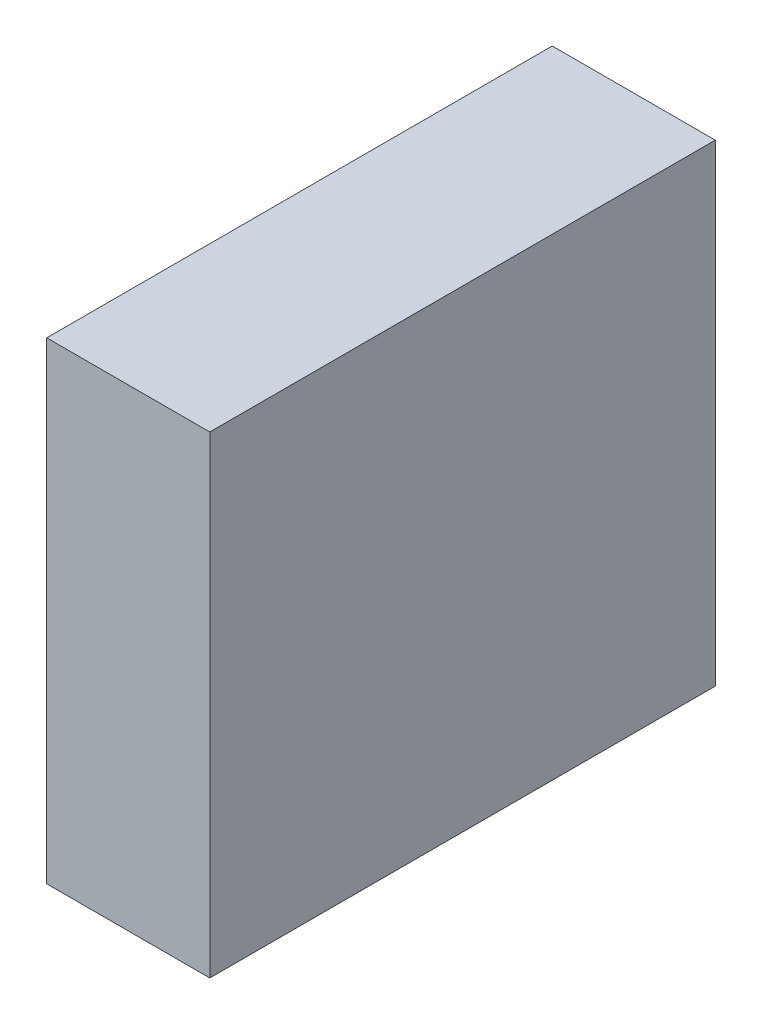
ISO-10303-21;
HEADER;
FILE_DESCRIPTION(('STEP AP214'),'2;1');
FILE_NAME('part.step','',(''),(''),'','','');
FILE_SCHEMA(('AUTOMOTIVE_DESIGN { 1 0 10303 214 1 1 1 1 }'));
ENDSEC;
DATA;
#1=APPLICATION_CONTEXT('core data for automotive mechanical design processes');
#2=APPLICATION_PROTOCOL_DEFINITION('international standard','automotive_design',2000,#1);
#3=PRODUCT_CONTEXT('',#1,'mechanical');
#4=PRODUCT('Part','Part','',(#3));
#5=PRODUCT_RELATED_PRODUCT_CATEGORY('part','',(#4));
#6=PRODUCT_DEFINITION_FORMATION('','',#4);
#7=PRODUCT_DEFINITION_CONTEXT('part definition',#1,'design');
#8=PRODUCT_DEFINITION('design','',#6,#7);
#9=PRODUCT_DEFINITION_SHAPE('','',#8);
#10=(LENGTH_UNIT() NAMED_UNIT(*) SI_UNIT(.MILLI.,.METRE.));
#11=(NAMED_UNIT(*) PLANE_ANGLE_UNIT() SI_UNIT($,.RADIAN.));
#12=(NAMED_UNIT(*) SI_UNIT($,.STERADIAN.) SOLID_ANGLE_UNIT());
#13=UNCERTAINTY_MEASURE_WITH_UNIT(LENGTH_MEASURE(1.E-05),#10,'distance_accuracy_value','');
#14=(GEOMETRIC_REPRESENTATION_CONTEXT(3) GLOBAL_UNCERTAINTY_ASSIGNED_CONTEXT((#13)) GLOBAL_UNIT_ASSIGNED_CONTEXT((#10,
#11,#12)) REPRESENTATION_CONTEXT('',''));
#15=CARTESIAN_POINT('',(0.,0.,0.));
#16=DIRECTION('',(0.,0.,1.));
#17=DIRECTION('',(1.,0.,0.));
#18=AXIS2_PLACEMENT_3D('',#15,#16,#17);
#19=CARTESIAN_POINT('',(-0.2499995,0.72499982,0.));
#20=DIRECTION('',(1.,0.,0.));
#21=DIRECTION('',(0.,-1.,0.));
#22=AXIS2_PLACEMENT_3D('',#19,#20,#21);
#23=PLANE('',#22);
#24=DIRECTION('',(0.,-1.,0.));
#25=VECTOR('',#24,1.);
#26=CARTESIAN_POINT('',(-0.2499995,0.72499982,0.));
#27=LINE('',#26,#25);
#28=CARTESIAN_POINT('',(-0.2499995,0.72499982,0.));
#29=VERTEX_POINT('',#28);
#30=CARTESIAN_POINT('',(-0.2499995,-0.72499982,0.));
#31=VERTEX_POINT('',#30);
#32=EDGE_CURVE('E11',#29,#31,#27,.T.);
#33=ORIENTED_EDGE('',*,*,#32,.T.);
#34=DIRECTION('',(0.,0.,1.));
#35=VECTOR('',#34,1.);
#36=CARTESIAN_POINT('',(-0.2499995,-0.72499982,0.));
#37=LINE('',#36,#35);
#38=CARTESIAN_POINT('',(-0.2499995,-0.72499982,1.54999944));
#39=VERTEX_POINT('',#38);
#40=EDGE_CURVE('E23',#31,#39,#37,.T.);
#41=ORIENTED_EDGE('',*,*,#40,.T.);
#42=DIRECTION('',(0.,-1.,0.));
#43=VECTOR('',#42,1.);
#44=CARTESIAN_POINT('',(-0.2499995,0.72499982,1.54999944));
#45=LINE('',#44,#43);
#46=CARTESIAN_POINT('',(-0.2499995,0.72499982,1.54999944));
#47=VERTEX_POINT('',#46);
#48=EDGE_CURVE('E86',#47,#39,#45,.T.);
#49=ORIENTED_EDGE('',*,*,#48,.F.);
#50=DIRECTION('',(0.,0.,1.));
#51=VECTOR('',#50,1.);
#52=CARTESIAN_POINT('',(-0.2499995,0.72499982,0.));
#53=LINE('',#52,#51);
#54=EDGE_CURVE('E35',#29,#47,#53,.T.);
#55=ORIENTED_EDGE('',*,*,#54,.F.);
#56=EDGE_LOOP('',(#33,#41,#49,#55));
#57=FACE_BOUND('',#56,.T.);
#58=ADVANCED_FACE('F16',(#57),#23,.F.);
#59=CARTESIAN_POINT('',(-0.2499995,-0.72499982,0.));
#60=DIRECTION('',(0.,1.,0.));
#61=DIRECTION('',(1.,0.,0.));
#62=AXIS2_PLACEMENT_3D('',#59,#60,#61);
#63=PLANE('',#62);
#64=DIRECTION('',(1.,0.,0.));
#65=VECTOR('',#64,1.);
#66=CARTESIAN_POINT('',(-0.2499995,-0.72499982,0.));
#67=LINE('',#66,#65);
#68=CARTESIAN_POINT('',(0.2499995,-0.72499982,0.));
#69=VERTEX_POINT('',#68);
#70=EDGE_CURVE('E83',#31,#69,#67,.T.);
#71=ORIENTED_EDGE('',*,*,#70,.T.);
#72=DIRECTION('',(0.,0.,1.));
#73=VECTOR('',#72,1.);
#74=CARTESIAN_POINT('',(0.2499995,-0.72499982,0.));
#75=LINE('',#74,#73);
#76=CARTESIAN_POINT('',(0.2499995,-0.72499982,1.54999944));
#77=VERTEX_POINT('',#76);
#78=EDGE_CURVE('E81',#69,#77,#75,.T.);
#79=ORIENTED_EDGE('',*,*,#78,.T.);
#80=DIRECTION('',(1.,0.,0.));
#81=VECTOR('',#80,1.);
#82=CARTESIAN_POINT('',(-0.2499995,-0.72499982,1.54999944));
#83=LINE('',#82,#81);
#84=EDGE_CURVE('E61',#39,#77,#83,.T.);
#85=ORIENTED_EDGE('',*,*,#84,.F.);
#86=ORIENTED_EDGE('',*,*,#40,.F.);
#87=EDGE_LOOP('',(#71,#79,#85,#86));
#88=FACE_BOUND('',#87,.T.);
#89=ADVANCED_FACE('F88',(#88),#63,.F.);
#90=CARTESIAN_POINT('',(0.2499995,-0.72499982,0.));
#91=DIRECTION('',(-1.,0.,0.));
#92=DIRECTION('',(0.,1.,0.));
#93=AXIS2_PLACEMENT_3D('',#90,#91,#92);
#94=PLANE('',#93);
#95=DIRECTION('',(0.,1.,0.));
#96=VECTOR('',#95,1.);
#97=CARTESIAN_POINT('',(0.2499995,-0.72499982,0.));
#98=LINE('',#97,#96);
#99=CARTESIAN_POINT('',(0.2499995,0.72499982,0.));
#100=VERTEX_POINT('',#99);
#101=EDGE_CURVE('E70',#69,#100,#98,.T.);
#102=ORIENTED_EDGE('',*,*,#101,.T.);
#103=DIRECTION('',(0.,0.,1.));
#104=VECTOR('',#103,1.);
#105=CARTESIAN_POINT('',(0.2499995,0.72499982,0.));
#106=LINE('',#105,#104);
#107=CARTESIAN_POINT('',(0.2499995,0.72499982,1.54999944));
#108=VERTEX_POINT('',#107);
#109=EDGE_CURVE('E64',#100,#108,#106,.T.);
#110=ORIENTED_EDGE('',*,*,#109,.T.);
#111=DIRECTION('',(0.,1.,0.));
#112=VECTOR('',#111,1.);
#113=CARTESIAN_POINT('',(0.2499995,-0.72499982,1.54999944));
#114=LINE('',#113,#112);
#115=EDGE_CURVE('E56',#77,#108,#114,.T.);
#116=ORIENTED_EDGE('',*,*,#115,.F.);
#117=ORIENTED_EDGE('',*,*,#78,.F.);
#118=EDGE_LOOP('',(#102,#110,#116,#117));
#119=FACE_BOUND('',#118,.T.);
#120=ADVANCED_FACE('F68',(#119),#94,.F.);
#121=CARTESIAN_POINT('',(0.2499995,0.72499982,0.));
#122=DIRECTION('',(0.,-1.,0.));
#123=DIRECTION('',(-1.,0.,0.));
#124=AXIS2_PLACEMENT_3D('',#121,#122,#123);
#125=PLANE('',#124);
#126=DIRECTION('',(-1.,0.,0.));
#127=VECTOR('',#126,1.);
#128=CARTESIAN_POINT('',(0.2499995,0.72499982,0.));
#129=LINE('',#128,#127);
#130=EDGE_CURVE('E65',#100,#29,#129,.T.);
#131=ORIENTED_EDGE('',*,*,#130,.T.);
#132=ORIENTED_EDGE('',*,*,#54,.T.);
#133=DIRECTION('',(-1.,0.,0.));
#134=VECTOR('',#133,1.);
#135=CARTESIAN_POINT('',(0.2499995,0.72499982,1.54999944));
#136=LINE('',#135,#134);
#137=EDGE_CURVE('E60',#108,#47,#136,.T.);
#138=ORIENTED_EDGE('',*,*,#137,.F.);
#139=ORIENTED_EDGE('',*,*,#109,.F.);
#140=EDGE_LOOP('',(#131,#132,#138,#139));
#141=FACE_BOUND('',#140,.T.);
#142=ADVANCED_FACE('F75',(#141),#125,.F.);
#143=CARTESIAN_POINT('',(-0.2499995,0.72499982,0.));
#144=DIRECTION('',(0.,0.,-1.));
#145=DIRECTION('',(-1.,0.,0.));
#146=AXIS2_PLACEMENT_3D('',#143,#144,#145);
#147=PLANE('',#146);
#148=ORIENTED_EDGE('',*,*,#130,.F.);
#149=ORIENTED_EDGE('',*,*,#101,.F.);
#150=ORIENTED_EDGE('',*,*,#70,.F.);
#151=ORIENTED_EDGE('',*,*,#32,.F.);
#152=EDGE_LOOP('',(#148,#149,#150,#151));
#153=FACE_BOUND('',#152,.T.);
#154=ADVANCED_FACE('F90',(#153),#147,.T.);
#155=CARTESIAN_POINT('',(-0.2499995,0.72499982,1.54999944));
#156=DIRECTION('',(0.,0.,-1.));
#157=DIRECTION('',(-1.,0.,0.));
#158=AXIS2_PLACEMENT_3D('',#155,#156,#157);
#159=PLANE('',#158);
#160=ORIENTED_EDGE('',*,*,#48,.T.);
#161=ORIENTED_EDGE('',*,*,#84,.T.);
#162=ORIENTED_EDGE('',*,*,#115,.T.);
#163=ORIENTED_EDGE('',*,*,#137,.T.);
#164=EDGE_LOOP('',(#160,#161,#162,#163));
#165=FACE_BOUND('',#164,.T.);
#166=ADVANCED_FACE('F58',(#165),#159,.F.);
#167=CLOSED_SHELL('',(#58,#89,#120,#142,#154,#166));
#168=MANIFOLD_SOLID_BREP('B1',#167);
#169=ADVANCED_BREP_SHAPE_REPRESENTATION('',(#18,#168),#14);
#170=SHAPE_DEFINITION_REPRESENTATION(#9,#169);
ENDSEC;
END-ISO-10303-21;
